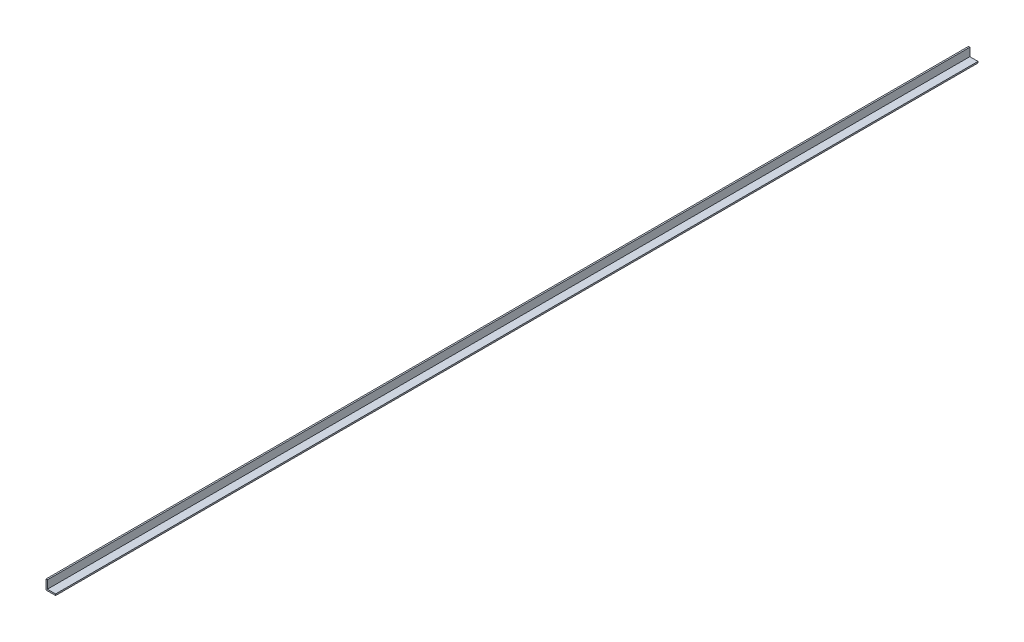
ISO-10303-21;
HEADER;
FILE_DESCRIPTION(('STEP AP214'),'2;1');
FILE_NAME('part.step','',(''),(''),'','','');
FILE_SCHEMA(('AUTOMOTIVE_DESIGN { 1 0 10303 214 1 1 1 1 }'));
ENDSEC;
DATA;
#1=APPLICATION_CONTEXT('core data for automotive mechanical design processes');
#2=APPLICATION_PROTOCOL_DEFINITION('international standard','automotive_design',2000,#1);
#3=PRODUCT_CONTEXT('',#1,'mechanical');
#4=PRODUCT('Part','Part','',(#3));
#5=PRODUCT_RELATED_PRODUCT_CATEGORY('part','',(#4));
#6=PRODUCT_DEFINITION_FORMATION('','',#4);
#7=PRODUCT_DEFINITION_CONTEXT('part definition',#1,'design');
#8=PRODUCT_DEFINITION('design','',#6,#7);
#9=PRODUCT_DEFINITION_SHAPE('','',#8);
#10=(LENGTH_UNIT() NAMED_UNIT(*) SI_UNIT(.MILLI.,.METRE.));
#11=(NAMED_UNIT(*) PLANE_ANGLE_UNIT() SI_UNIT($,.RADIAN.));
#12=(NAMED_UNIT(*) SI_UNIT($,.STERADIAN.) SOLID_ANGLE_UNIT());
#13=UNCERTAINTY_MEASURE_WITH_UNIT(LENGTH_MEASURE(1.E-05),#10,'distance_accuracy_value','');
#14=(GEOMETRIC_REPRESENTATION_CONTEXT(3) GLOBAL_UNCERTAINTY_ASSIGNED_CONTEXT((#13)) GLOBAL_UNIT_ASSIGNED_CONTEXT((#10,
#11,#12)) REPRESENTATION_CONTEXT('',''));
#15=CARTESIAN_POINT('',(0.,0.,0.));
#16=DIRECTION('',(0.,0.,1.));
#17=DIRECTION('',(1.,0.,0.));
#18=AXIS2_PLACEMENT_3D('',#15,#16,#17);
#19=CARTESIAN_POINT('',(9.53,63.5,-6100.));
#20=DIRECTION('',(0.,1.,0.));
#21=DIRECTION('',(0.,0.,1.));
#22=AXIS2_PLACEMENT_3D('',#19,#20,#21);
#23=PLANE('',#22);
#24=DIRECTION('',(-1.,0.,0.));
#25=VECTOR('',#24,1.);
#26=CARTESIAN_POINT('',(9.53,63.5,0.));
#27=LINE('',#26,#25);
#28=CARTESIAN_POINT('',(9.53,63.5,0.));
#29=VERTEX_POINT('',#28);
#30=CARTESIAN_POINT('',(0.,63.5,0.));
#31=VERTEX_POINT('',#30);
#32=EDGE_CURVE('E118',#29,#31,#27,.T.);
#33=ORIENTED_EDGE('',*,*,#32,.F.);
#34=DIRECTION('',(0.,0.,1.));
#35=VECTOR('',#34,1.);
#36=CARTESIAN_POINT('',(9.53,63.5,-6100.));
#37=LINE('',#36,#35);
#38=CARTESIAN_POINT('',(9.53,63.5,-6100.));
#39=VERTEX_POINT('',#38);
#40=EDGE_CURVE('E11',#39,#29,#37,.T.);
#41=ORIENTED_EDGE('',*,*,#40,.F.);
#42=DIRECTION('',(-1.,0.,0.));
#43=VECTOR('',#42,1.);
#44=CARTESIAN_POINT('',(9.53,63.5,-6100.));
#45=LINE('',#44,#43);
#46=CARTESIAN_POINT('',(0.,63.5,-6100.));
#47=VERTEX_POINT('',#46);
#48=EDGE_CURVE('E132',#39,#47,#45,.T.);
#49=ORIENTED_EDGE('',*,*,#48,.T.);
#50=DIRECTION('',(0.,0.,1.));
#51=VECTOR('',#50,1.);
#52=CARTESIAN_POINT('',(0.,63.5,-6100.));
#53=LINE('',#52,#51);
#54=EDGE_CURVE('E36',#47,#31,#53,.T.);
#55=ORIENTED_EDGE('',*,*,#54,.T.);
#56=EDGE_LOOP('',(#33,#41,#49,#55));
#57=FACE_BOUND('',#56,.T.);
#58=ADVANCED_FACE('F33',(#57),#23,.T.);
#59=CARTESIAN_POINT('',(9.53,9.52999999999999,-6100.));
#60=DIRECTION('',(1.,0.,0.));
#61=DIRECTION('',(0.,0.,-1.));
#62=AXIS2_PLACEMENT_3D('',#59,#60,#61);
#63=PLANE('',#62);
#64=DIRECTION('',(0.,1.,0.));
#65=VECTOR('',#64,1.);
#66=CARTESIAN_POINT('',(9.53,9.52999999999999,0.));
#67=LINE('',#66,#65);
#68=CARTESIAN_POINT('',(9.53,9.52999999999999,0.));
#69=VERTEX_POINT('',#68);
#70=EDGE_CURVE('E130',#69,#29,#67,.T.);
#71=ORIENTED_EDGE('',*,*,#70,.F.);
#72=DIRECTION('',(0.,0.,1.));
#73=VECTOR('',#72,1.);
#74=CARTESIAN_POINT('',(9.53,9.52999999999999,-6100.));
#75=LINE('',#74,#73);
#76=CARTESIAN_POINT('',(9.53,9.52999999999999,-6100.));
#77=VERTEX_POINT('',#76);
#78=EDGE_CURVE('E42',#77,#69,#75,.T.);
#79=ORIENTED_EDGE('',*,*,#78,.F.);
#80=DIRECTION('',(0.,1.,0.));
#81=VECTOR('',#80,1.);
#82=CARTESIAN_POINT('',(9.53,9.52999999999999,-6100.));
#83=LINE('',#82,#81);
#84=EDGE_CURVE('E108',#77,#39,#83,.T.);
#85=ORIENTED_EDGE('',*,*,#84,.T.);
#86=ORIENTED_EDGE('',*,*,#40,.T.);
#87=EDGE_LOOP('',(#71,#79,#85,#86));
#88=FACE_BOUND('',#87,.T.);
#89=ADVANCED_FACE('F140',(#88),#63,.T.);
#90=CARTESIAN_POINT('',(63.5,9.53,-6100.));
#91=DIRECTION('',(0.,1.,0.));
#92=DIRECTION('',(-1.,0.,0.));
#93=AXIS2_PLACEMENT_3D('',#90,#91,#92);
#94=PLANE('',#93);
#95=DIRECTION('',(-1.,0.,0.));
#96=VECTOR('',#95,1.);
#97=CARTESIAN_POINT('',(63.5,9.53,0.));
#98=LINE('',#97,#96);
#99=CARTESIAN_POINT('',(63.5,9.53,0.));
#100=VERTEX_POINT('',#99);
#101=EDGE_CURVE('E95',#100,#69,#98,.T.);
#102=ORIENTED_EDGE('',*,*,#101,.F.);
#103=DIRECTION('',(0.,0.,1.));
#104=VECTOR('',#103,1.);
#105=CARTESIAN_POINT('',(63.5,9.53,-6100.));
#106=LINE('',#105,#104);
#107=CARTESIAN_POINT('',(63.5,9.53,-6100.));
#108=VERTEX_POINT('',#107);
#109=EDGE_CURVE('E90',#108,#100,#106,.T.);
#110=ORIENTED_EDGE('',*,*,#109,.F.);
#111=DIRECTION('',(-1.,0.,0.));
#112=VECTOR('',#111,1.);
#113=CARTESIAN_POINT('',(63.5,9.53,-6100.));
#114=LINE('',#113,#112);
#115=EDGE_CURVE('E93',#108,#77,#114,.T.);
#116=ORIENTED_EDGE('',*,*,#115,.T.);
#117=ORIENTED_EDGE('',*,*,#78,.T.);
#118=EDGE_LOOP('',(#102,#110,#116,#117));
#119=FACE_BOUND('',#118,.T.);
#120=ADVANCED_FACE('F92',(#119),#94,.T.);
#121=CARTESIAN_POINT('',(63.5,0.,-6100.));
#122=DIRECTION('',(1.,0.,0.));
#123=DIRECTION('',(0.,0.,-1.));
#124=AXIS2_PLACEMENT_3D('',#121,#122,#123);
#125=PLANE('',#124);
#126=DIRECTION('',(0.,1.,0.));
#127=VECTOR('',#126,1.);
#128=CARTESIAN_POINT('',(63.5,0.,0.));
#129=LINE('',#128,#127);
#130=CARTESIAN_POINT('',(63.5,0.,0.));
#131=VERTEX_POINT('',#130);
#132=EDGE_CURVE('E127',#131,#100,#129,.T.);
#133=ORIENTED_EDGE('',*,*,#132,.F.);
#134=DIRECTION('',(0.,0.,1.));
#135=VECTOR('',#134,1.);
#136=CARTESIAN_POINT('',(63.5,0.,-6100.));
#137=LINE('',#136,#135);
#138=CARTESIAN_POINT('',(63.5,0.,-6100.));
#139=VERTEX_POINT('',#138);
#140=EDGE_CURVE('E100',#139,#131,#137,.T.);
#141=ORIENTED_EDGE('',*,*,#140,.F.);
#142=DIRECTION('',(0.,1.,0.));
#143=VECTOR('',#142,1.);
#144=CARTESIAN_POINT('',(63.5,0.,-6100.));
#145=LINE('',#144,#143);
#146=EDGE_CURVE('E106',#139,#108,#145,.T.);
#147=ORIENTED_EDGE('',*,*,#146,.T.);
#148=ORIENTED_EDGE('',*,*,#109,.T.);
#149=EDGE_LOOP('',(#133,#141,#147,#148));
#150=FACE_BOUND('',#149,.T.);
#151=ADVANCED_FACE('F110',(#150),#125,.T.);
#152=CARTESIAN_POINT('',(0.,0.,-6100.));
#153=DIRECTION('',(0.,-1.,0.));
#154=DIRECTION('',(0.,0.,-1.));
#155=AXIS2_PLACEMENT_3D('',#152,#153,#154);
#156=PLANE('',#155);
#157=DIRECTION('',(1.,0.,0.));
#158=VECTOR('',#157,1.);
#159=CARTESIAN_POINT('',(0.,0.,0.));
#160=LINE('',#159,#158);
#161=CARTESIAN_POINT('',(0.,0.,0.));
#162=VERTEX_POINT('',#161);
#163=EDGE_CURVE('E124',#162,#131,#160,.T.);
#164=ORIENTED_EDGE('',*,*,#163,.F.);
#165=DIRECTION('',(0.,0.,1.));
#166=VECTOR('',#165,1.);
#167=CARTESIAN_POINT('',(0.,0.,-6100.));
#168=LINE('',#167,#166);
#169=CARTESIAN_POINT('',(0.,0.,-6100.));
#170=VERTEX_POINT('',#169);
#171=EDGE_CURVE('E135',#170,#162,#168,.T.);
#172=ORIENTED_EDGE('',*,*,#171,.F.);
#173=DIRECTION('',(1.,0.,0.));
#174=VECTOR('',#173,1.);
#175=CARTESIAN_POINT('',(0.,0.,-6100.));
#176=LINE('',#175,#174);
#177=EDGE_CURVE('E111',#170,#139,#176,.T.);
#178=ORIENTED_EDGE('',*,*,#177,.T.);
#179=ORIENTED_EDGE('',*,*,#140,.T.);
#180=EDGE_LOOP('',(#164,#172,#178,#179));
#181=FACE_BOUND('',#180,.T.);
#182=ADVANCED_FACE('F153',(#181),#156,.T.);
#183=CARTESIAN_POINT('',(0.,63.5,-6100.));
#184=DIRECTION('',(-1.,0.,0.));
#185=DIRECTION('',(0.,-1.,0.));
#186=AXIS2_PLACEMENT_3D('',#183,#184,#185);
#187=PLANE('',#186);
#188=DIRECTION('',(0.,-1.,0.));
#189=VECTOR('',#188,1.);
#190=CARTESIAN_POINT('',(0.,63.5,0.));
#191=LINE('',#190,#189);
#192=EDGE_CURVE('E121',#31,#162,#191,.T.);
#193=ORIENTED_EDGE('',*,*,#192,.F.);
#194=ORIENTED_EDGE('',*,*,#54,.F.);
#195=DIRECTION('',(0.,-1.,0.));
#196=VECTOR('',#195,1.);
#197=CARTESIAN_POINT('',(0.,63.5,-6100.));
#198=LINE('',#197,#196);
#199=EDGE_CURVE('E113',#47,#170,#198,.T.);
#200=ORIENTED_EDGE('',*,*,#199,.T.);
#201=ORIENTED_EDGE('',*,*,#171,.T.);
#202=EDGE_LOOP('',(#193,#194,#200,#201));
#203=FACE_BOUND('',#202,.T.);
#204=ADVANCED_FACE('F137',(#203),#187,.T.);
#205=CARTESIAN_POINT('',(0.,0.,-6100.));
#206=DIRECTION('',(0.,0.,1.));
#207=DIRECTION('',(1.,0.,0.));
#208=AXIS2_PLACEMENT_3D('',#205,#206,#207);
#209=PLANE('',#208);
#210=ORIENTED_EDGE('',*,*,#48,.F.);
#211=ORIENTED_EDGE('',*,*,#84,.F.);
#212=ORIENTED_EDGE('',*,*,#115,.F.);
#213=ORIENTED_EDGE('',*,*,#146,.F.);
#214=ORIENTED_EDGE('',*,*,#177,.F.);
#215=ORIENTED_EDGE('',*,*,#199,.F.);
#216=EDGE_LOOP('',(#210,#211,#212,#213,#214,#215));
#217=FACE_BOUND('',#216,.T.);
#218=ADVANCED_FACE('F104',(#217),#209,.F.);
#219=CARTESIAN_POINT('',(0.,0.,0.));
#220=DIRECTION('',(0.,0.,1.));
#221=DIRECTION('',(1.,0.,0.));
#222=AXIS2_PLACEMENT_3D('',#219,#220,#221);
#223=PLANE('',#222);
#224=ORIENTED_EDGE('',*,*,#32,.T.);
#225=ORIENTED_EDGE('',*,*,#192,.T.);
#226=ORIENTED_EDGE('',*,*,#163,.T.);
#227=ORIENTED_EDGE('',*,*,#132,.T.);
#228=ORIENTED_EDGE('',*,*,#101,.T.);
#229=ORIENTED_EDGE('',*,*,#70,.T.);
#230=EDGE_LOOP('',(#224,#225,#226,#227,#228,#229));
#231=FACE_BOUND('',#230,.T.);
#232=ADVANCED_FACE('F139',(#231),#223,.T.);
#233=CLOSED_SHELL('',(#58,#89,#120,#151,#182,#204,#218,#232));
#234=MANIFOLD_SOLID_BREP('B2',#233);
#235=ADVANCED_BREP_SHAPE_REPRESENTATION('',(#18,#234),#14);
#236=SHAPE_DEFINITION_REPRESENTATION(#9,#235);
ENDSEC;
END-ISO-10303-21;
